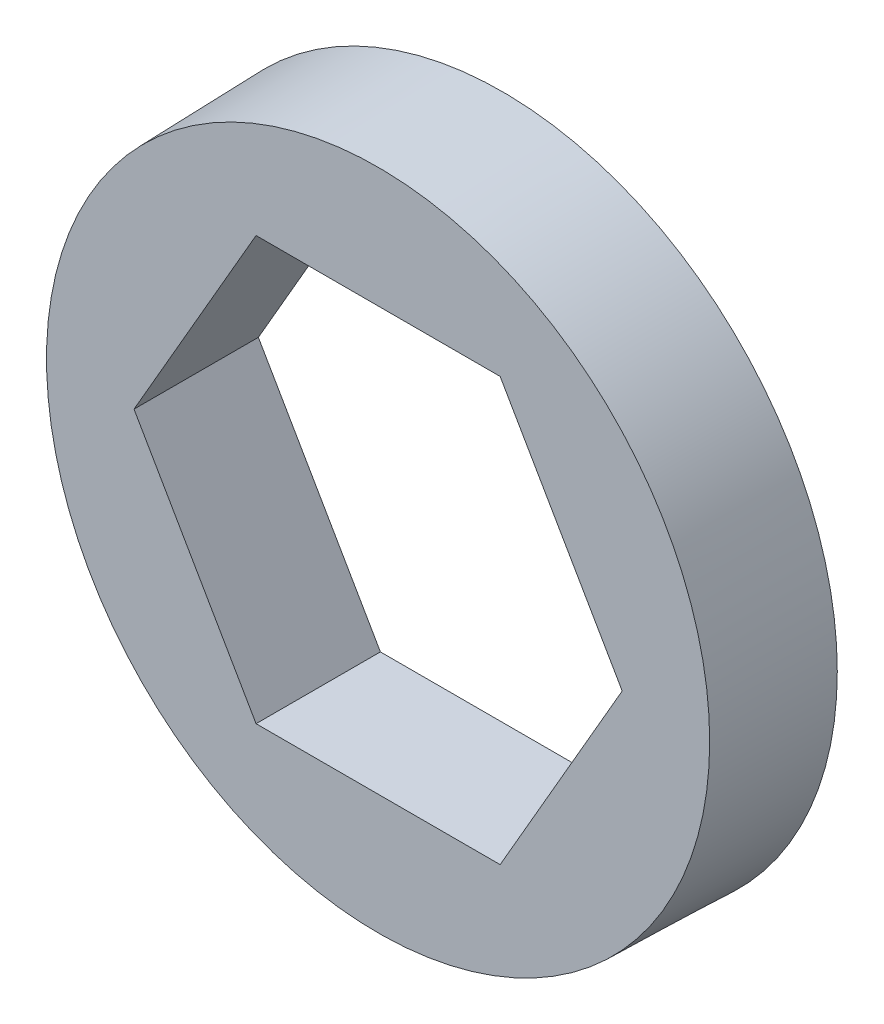
ISO-10303-21;
HEADER;
FILE_DESCRIPTION(('STEP AP214'),'2;1');
FILE_NAME('part.step','',(''),(''),'','','');
FILE_SCHEMA(('AUTOMOTIVE_DESIGN { 1 0 10303 214 1 1 1 1 }'));
ENDSEC;
DATA;
#1=APPLICATION_CONTEXT('core data for automotive mechanical design processes');
#2=APPLICATION_PROTOCOL_DEFINITION('international standard','automotive_design',2000,#1);
#3=PRODUCT_CONTEXT('',#1,'mechanical');
#4=PRODUCT('Part','Part','',(#3));
#5=PRODUCT_RELATED_PRODUCT_CATEGORY('part','',(#4));
#6=PRODUCT_DEFINITION_FORMATION('','',#4);
#7=PRODUCT_DEFINITION_CONTEXT('part definition',#1,'design');
#8=PRODUCT_DEFINITION('design','',#6,#7);
#9=PRODUCT_DEFINITION_SHAPE('','',#8);
#10=(LENGTH_UNIT() NAMED_UNIT(*) SI_UNIT(.MILLI.,.METRE.));
#11=(NAMED_UNIT(*) PLANE_ANGLE_UNIT() SI_UNIT($,.RADIAN.));
#12=(NAMED_UNIT(*) SI_UNIT($,.STERADIAN.) SOLID_ANGLE_UNIT());
#13=UNCERTAINTY_MEASURE_WITH_UNIT(LENGTH_MEASURE(1.E-05),#10,'distance_accuracy_value','');
#14=(GEOMETRIC_REPRESENTATION_CONTEXT(3) GLOBAL_UNCERTAINTY_ASSIGNED_CONTEXT((#13)) GLOBAL_UNIT_ASSIGNED_CONTEXT((#10,
#11,#12)) REPRESENTATION_CONTEXT('',''));
#15=CARTESIAN_POINT('',(0.,0.,0.));
#16=DIRECTION('',(0.,0.,1.));
#17=DIRECTION('',(1.,0.,0.));
#18=AXIS2_PLACEMENT_3D('',#15,#16,#17);
#19=CARTESIAN_POINT('',(0.,0.,0.75));
#20=DIRECTION('',(0.,0.,-1.));
#21=DIRECTION('',(-1.,0.,0.));
#22=AXIS2_PLACEMENT_3D('',#19,#20,#21);
#23=CONICAL_SURFACE('',#22,3.99999999999778,0.0261799387503542);
#24=CARTESIAN_POINT('',(0.,0.,-0.74999999996453));
#25=DIRECTION('',(0.,0.,1.));
#26=DIRECTION('',(1.,0.,0.));
#27=AXIS2_PLACEMENT_3D('',#24,#25,#26);
#28=CIRCLE('',#27,4.03927888230626);
#29=CARTESIAN_POINT('',(4.03927888230626,0.,-0.74999999996453));
#30=VERTEX_POINT('',#29);
#31=EDGE_CURVE('E11',#30,#30,#28,.T.);
#32=ORIENTED_EDGE('',*,*,#31,.T.);
#33=EDGE_LOOP('',(#32));
#34=FACE_BOUND('',#33,.T.);
#35=CARTESIAN_POINT('',(0.,0.,0.75));
#36=DIRECTION('',(0.,0.,1.));
#37=DIRECTION('',(1.,0.,0.));
#38=AXIS2_PLACEMENT_3D('',#35,#36,#37);
#39=CIRCLE('',#38,3.99999999999778);
#40=CARTESIAN_POINT('',(3.99999999999778,0.,0.75));
#41=VERTEX_POINT('',#40);
#42=EDGE_CURVE('E40',#41,#41,#39,.T.);
#43=ORIENTED_EDGE('',*,*,#42,.F.);
#44=EDGE_LOOP('',(#43));
#45=FACE_BOUND('',#44,.T.);
#46=ADVANCED_FACE('F33',(#34,#45),#23,.T.);
#47=CARTESIAN_POINT('',(4.03927888230626,0.,-0.749999999964529));
#48=DIRECTION('',(0.,0.,-1.));
#49=DIRECTION('',(-1.,0.,0.));
#50=AXIS2_PLACEMENT_3D('',#47,#48,#49);
#51=PLANE('',#50);
#52=DIRECTION('',(0.5,-0.866025403784439,0.));
#53=VECTOR('',#52,1.);
#54=CARTESIAN_POINT('',(1.47224318643355,2.55,-0.749999999964529));
#55=LINE('',#54,#53);
#56=CARTESIAN_POINT('',(1.47224318643355,2.55,-0.749999999964529));
#57=VERTEX_POINT('',#56);
#58=CARTESIAN_POINT('',(2.94448637286709,0.,-0.749999999964529));
#59=VERTEX_POINT('',#58);
#60=EDGE_CURVE('E47',#57,#59,#55,.T.);
#61=ORIENTED_EDGE('',*,*,#60,.F.);
#62=DIRECTION('',(1.,0.,0.));
#63=VECTOR('',#62,1.);
#64=CARTESIAN_POINT('',(-1.47224318643355,2.55,-0.749999999964529));
#65=LINE('',#64,#63);
#66=CARTESIAN_POINT('',(-1.47224318643355,2.55,-0.749999999964529));
#67=VERTEX_POINT('',#66);
#68=EDGE_CURVE('E104',#67,#57,#65,.T.);
#69=ORIENTED_EDGE('',*,*,#68,.F.);
#70=DIRECTION('',(0.5,0.866025403784439,0.));
#71=VECTOR('',#70,1.);
#72=CARTESIAN_POINT('',(-2.94448637286709,0.,-0.749999999964529));
#73=LINE('',#72,#71);
#74=CARTESIAN_POINT('',(-2.94448637286709,0.,-0.749999999964529));
#75=VERTEX_POINT('',#74);
#76=EDGE_CURVE('E107',#75,#67,#73,.T.);
#77=ORIENTED_EDGE('',*,*,#76,.F.);
#78=DIRECTION('',(-0.5,0.866025403784439,0.));
#79=VECTOR('',#78,1.);
#80=CARTESIAN_POINT('',(-1.47224318643355,-2.55,-0.749999999964529));
#81=LINE('',#80,#79);
#82=CARTESIAN_POINT('',(-1.47224318643355,-2.55,-0.749999999964529));
#83=VERTEX_POINT('',#82);
#84=EDGE_CURVE('E123',#83,#75,#81,.T.);
#85=ORIENTED_EDGE('',*,*,#84,.F.);
#86=DIRECTION('',(-1.,0.,0.));
#87=VECTOR('',#86,1.);
#88=CARTESIAN_POINT('',(1.47224318643355,-2.55,-0.749999999964529));
#89=LINE('',#88,#87);
#90=CARTESIAN_POINT('',(1.47224318643355,-2.55,-0.749999999964529));
#91=VERTEX_POINT('',#90);
#92=EDGE_CURVE('E120',#91,#83,#89,.T.);
#93=ORIENTED_EDGE('',*,*,#92,.F.);
#94=DIRECTION('',(-0.5,-0.866025403784439,0.));
#95=VECTOR('',#94,1.);
#96=CARTESIAN_POINT('',(2.94448637286709,0.,-0.749999999964529));
#97=LINE('',#96,#95);
#98=EDGE_CURVE('E118',#59,#91,#97,.T.);
#99=ORIENTED_EDGE('',*,*,#98,.F.);
#100=EDGE_LOOP('',(#61,#69,#77,#85,#93,#99));
#101=FACE_BOUND('',#100,.T.);
#102=ORIENTED_EDGE('',*,*,#31,.F.);
#103=EDGE_LOOP('',(#102));
#104=FACE_BOUND('',#103,.T.);
#105=ADVANCED_FACE('F140',(#101,#104),#51,.T.);
#106=CARTESIAN_POINT('',(0.,0.,0.75));
#107=DIRECTION('',(0.,0.,1.));
#108=DIRECTION('',(1.,0.,0.));
#109=AXIS2_PLACEMENT_3D('',#106,#107,#108);
#110=PLANE('',#109);
#111=DIRECTION('',(0.5,-0.866025403784439,0.));
#112=VECTOR('',#111,1.);
#113=CARTESIAN_POINT('',(1.47224318643355,2.55,0.75));
#114=LINE('',#113,#112);
#115=CARTESIAN_POINT('',(1.47224318643355,2.55,0.75));
#116=VERTEX_POINT('',#115);
#117=CARTESIAN_POINT('',(2.94448637286709,0.,0.75));
#118=VERTEX_POINT('',#117);
#119=EDGE_CURVE('E87',#116,#118,#114,.T.);
#120=ORIENTED_EDGE('',*,*,#119,.T.);
#121=DIRECTION('',(-0.5,-0.866025403784439,0.));
#122=VECTOR('',#121,1.);
#123=CARTESIAN_POINT('',(2.94448637286709,0.,0.75));
#124=LINE('',#123,#122);
#125=CARTESIAN_POINT('',(1.47224318643355,-2.55,0.75));
#126=VERTEX_POINT('',#125);
#127=EDGE_CURVE('E96',#118,#126,#124,.T.);
#128=ORIENTED_EDGE('',*,*,#127,.T.);
#129=DIRECTION('',(-1.,0.,0.));
#130=VECTOR('',#129,1.);
#131=CARTESIAN_POINT('',(1.47224318643355,-2.55,0.75));
#132=LINE('',#131,#130);
#133=CARTESIAN_POINT('',(-1.47224318643355,-2.55,0.75));
#134=VERTEX_POINT('',#133);
#135=EDGE_CURVE('E55',#126,#134,#132,.T.);
#136=ORIENTED_EDGE('',*,*,#135,.T.);
#137=DIRECTION('',(-0.5,0.866025403784439,0.));
#138=VECTOR('',#137,1.);
#139=CARTESIAN_POINT('',(-1.47224318643355,-2.55,0.75));
#140=LINE('',#139,#138);
#141=CARTESIAN_POINT('',(-2.94448637286709,0.,0.75));
#142=VERTEX_POINT('',#141);
#143=EDGE_CURVE('E111',#134,#142,#140,.T.);
#144=ORIENTED_EDGE('',*,*,#143,.T.);
#145=DIRECTION('',(0.5,0.866025403784439,0.));
#146=VECTOR('',#145,1.);
#147=CARTESIAN_POINT('',(-2.94448637286709,0.,0.75));
#148=LINE('',#147,#146);
#149=CARTESIAN_POINT('',(-1.47224318643355,2.55,0.75));
#150=VERTEX_POINT('',#149);
#151=EDGE_CURVE('E114',#142,#150,#148,.T.);
#152=ORIENTED_EDGE('',*,*,#151,.T.);
#153=DIRECTION('',(1.,0.,0.));
#154=VECTOR('',#153,1.);
#155=CARTESIAN_POINT('',(-1.47224318643355,2.55,0.75));
#156=LINE('',#155,#154);
#157=EDGE_CURVE('E93',#150,#116,#156,.T.);
#158=ORIENTED_EDGE('',*,*,#157,.T.);
#159=EDGE_LOOP('',(#120,#128,#136,#144,#152,#158));
#160=FACE_BOUND('',#159,.T.);
#161=ORIENTED_EDGE('',*,*,#42,.T.);
#162=EDGE_LOOP('',(#161));
#163=FACE_BOUND('',#162,.T.);
#164=ADVANCED_FACE('F100',(#160,#163),#110,.T.);
#165=CARTESIAN_POINT('',(1.47224318643355,2.55,0.75));
#166=DIRECTION('',(0.866025403784439,0.5,0.));
#167=DIRECTION('',(-0.5,0.866025403784439,0.));
#168=AXIS2_PLACEMENT_3D('',#165,#166,#167);
#169=PLANE('',#168);
#170=ORIENTED_EDGE('',*,*,#60,.T.);
#171=DIRECTION('',(0.,0.,-1.));
#172=VECTOR('',#171,1.);
#173=CARTESIAN_POINT('',(2.94448637286709,0.,0.75));
#174=LINE('',#173,#172);
#175=EDGE_CURVE('E83',#118,#59,#174,.T.);
#176=ORIENTED_EDGE('',*,*,#175,.F.);
#177=ORIENTED_EDGE('',*,*,#119,.F.);
#178=DIRECTION('',(0.,0.,-1.));
#179=VECTOR('',#178,1.);
#180=CARTESIAN_POINT('',(1.47224318643355,2.55,0.75));
#181=LINE('',#180,#179);
#182=EDGE_CURVE('E128',#116,#57,#181,.T.);
#183=ORIENTED_EDGE('',*,*,#182,.T.);
#184=EDGE_LOOP('',(#170,#176,#177,#183));
#185=FACE_BOUND('',#184,.T.);
#186=ADVANCED_FACE('F85',(#185),#169,.F.);
#187=CARTESIAN_POINT('',(-1.47224318643355,2.55,0.75));
#188=DIRECTION('',(0.,1.,0.));
#189=DIRECTION('',(-1.,0.,0.));
#190=AXIS2_PLACEMENT_3D('',#187,#188,#189);
#191=PLANE('',#190);
#192=ORIENTED_EDGE('',*,*,#68,.T.);
#193=ORIENTED_EDGE('',*,*,#182,.F.);
#194=ORIENTED_EDGE('',*,*,#157,.F.);
#195=DIRECTION('',(0.,0.,-1.));
#196=VECTOR('',#195,1.);
#197=CARTESIAN_POINT('',(-1.47224318643355,2.55,0.75));
#198=LINE('',#197,#196);
#199=EDGE_CURVE('E130',#150,#67,#198,.T.);
#200=ORIENTED_EDGE('',*,*,#199,.T.);
#201=EDGE_LOOP('',(#192,#193,#194,#200));
#202=FACE_BOUND('',#201,.T.);
#203=ADVANCED_FACE('F155',(#202),#191,.F.);
#204=CARTESIAN_POINT('',(-2.94448637286709,0.,0.75));
#205=DIRECTION('',(-0.866025403784439,0.5,0.));
#206=DIRECTION('',(-0.5,-0.866025403784439,0.));
#207=AXIS2_PLACEMENT_3D('',#204,#205,#206);
#208=PLANE('',#207);
#209=ORIENTED_EDGE('',*,*,#76,.T.);
#210=ORIENTED_EDGE('',*,*,#199,.F.);
#211=ORIENTED_EDGE('',*,*,#151,.F.);
#212=DIRECTION('',(0.,0.,-1.));
#213=VECTOR('',#212,1.);
#214=CARTESIAN_POINT('',(-2.94448637286709,0.,0.75));
#215=LINE('',#214,#213);
#216=EDGE_CURVE('E132',#142,#75,#215,.T.);
#217=ORIENTED_EDGE('',*,*,#216,.T.);
#218=EDGE_LOOP('',(#209,#210,#211,#217));
#219=FACE_BOUND('',#218,.T.);
#220=ADVANCED_FACE('F164',(#219),#208,.F.);
#221=CARTESIAN_POINT('',(-1.47224318643355,-2.55,0.75));
#222=DIRECTION('',(-0.866025403784439,-0.5,0.));
#223=DIRECTION('',(0.5,-0.866025403784439,0.));
#224=AXIS2_PLACEMENT_3D('',#221,#222,#223);
#225=PLANE('',#224);
#226=ORIENTED_EDGE('',*,*,#84,.T.);
#227=ORIENTED_EDGE('',*,*,#216,.F.);
#228=ORIENTED_EDGE('',*,*,#143,.F.);
#229=DIRECTION('',(0.,0.,-1.));
#230=VECTOR('',#229,1.);
#231=CARTESIAN_POINT('',(-1.47224318643355,-2.55,0.75));
#232=LINE('',#231,#230);
#233=EDGE_CURVE('E134',#134,#83,#232,.T.);
#234=ORIENTED_EDGE('',*,*,#233,.T.);
#235=EDGE_LOOP('',(#226,#227,#228,#234));
#236=FACE_BOUND('',#235,.T.);
#237=ADVANCED_FACE('F161',(#236),#225,.F.);
#238=CARTESIAN_POINT('',(1.47224318643355,-2.55,0.75));
#239=DIRECTION('',(0.,-1.,0.));
#240=DIRECTION('',(1.,0.,0.));
#241=AXIS2_PLACEMENT_3D('',#238,#239,#240);
#242=PLANE('',#241);
#243=ORIENTED_EDGE('',*,*,#92,.T.);
#244=ORIENTED_EDGE('',*,*,#233,.F.);
#245=ORIENTED_EDGE('',*,*,#135,.F.);
#246=DIRECTION('',(0.,0.,-1.));
#247=VECTOR('',#246,1.);
#248=CARTESIAN_POINT('',(1.47224318643355,-2.55,0.75));
#249=LINE('',#248,#247);
#250=EDGE_CURVE('E92',#126,#91,#249,.T.);
#251=ORIENTED_EDGE('',*,*,#250,.T.);
#252=EDGE_LOOP('',(#243,#244,#245,#251));
#253=FACE_BOUND('',#252,.T.);
#254=ADVANCED_FACE('F158',(#253),#242,.F.);
#255=CARTESIAN_POINT('',(2.94448637286709,0.,0.75));
#256=DIRECTION('',(0.866025403784439,-0.5,0.));
#257=DIRECTION('',(0.5,0.866025403784439,0.));
#258=AXIS2_PLACEMENT_3D('',#255,#256,#257);
#259=PLANE('',#258);
#260=ORIENTED_EDGE('',*,*,#98,.T.);
#261=ORIENTED_EDGE('',*,*,#250,.F.);
#262=ORIENTED_EDGE('',*,*,#127,.F.);
#263=ORIENTED_EDGE('',*,*,#175,.T.);
#264=EDGE_LOOP('',(#260,#261,#262,#263));
#265=FACE_BOUND('',#264,.T.);
#266=ADVANCED_FACE('F97',(#265),#259,.F.);
#267=CLOSED_SHELL('',(#46,#105,#164,#186,#203,#220,#237,#254,#266));
#268=MANIFOLD_SOLID_BREP('B2',#267);
#269=ADVANCED_BREP_SHAPE_REPRESENTATION('',(#18,#268),#14);
#270=SHAPE_DEFINITION_REPRESENTATION(#9,#269);
ENDSEC;
END-ISO-10303-21;
